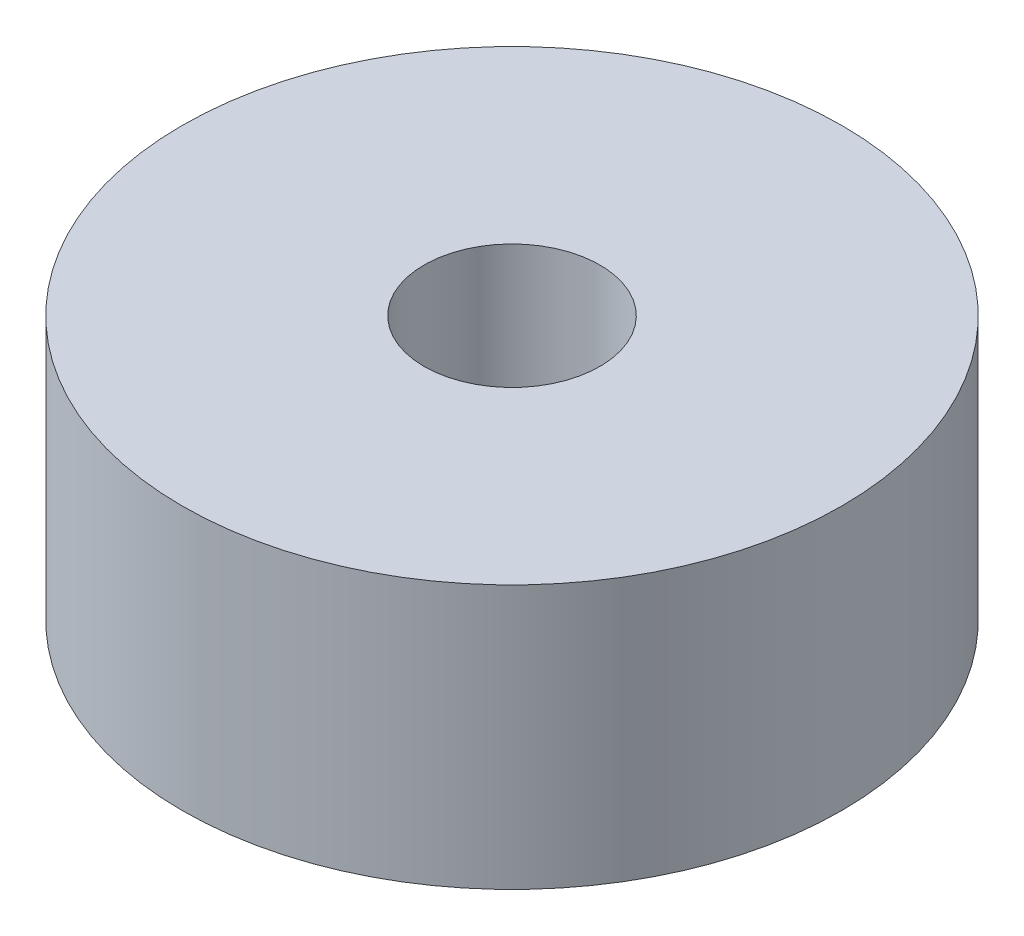
ISO-10303-21;
HEADER;
FILE_DESCRIPTION(('STEP AP214'),'2;1');
FILE_NAME('part.step','',(''),(''),'','','');
FILE_SCHEMA(('AUTOMOTIVE_DESIGN { 1 0 10303 214 1 1 1 1 }'));
ENDSEC;
DATA;
#1=APPLICATION_CONTEXT('core data for automotive mechanical design processes');
#2=APPLICATION_PROTOCOL_DEFINITION('international standard','automotive_design',2000,#1);
#3=PRODUCT_CONTEXT('',#1,'mechanical');
#4=PRODUCT('Part','Part','',(#3));
#5=PRODUCT_RELATED_PRODUCT_CATEGORY('part','',(#4));
#6=PRODUCT_DEFINITION_FORMATION('','',#4);
#7=PRODUCT_DEFINITION_CONTEXT('part definition',#1,'design');
#8=PRODUCT_DEFINITION('design','',#6,#7);
#9=PRODUCT_DEFINITION_SHAPE('','',#8);
#10=(LENGTH_UNIT() NAMED_UNIT(*) SI_UNIT(.MILLI.,.METRE.));
#11=(NAMED_UNIT(*) PLANE_ANGLE_UNIT() SI_UNIT($,.RADIAN.));
#12=(NAMED_UNIT(*) SI_UNIT($,.STERADIAN.) SOLID_ANGLE_UNIT());
#13=UNCERTAINTY_MEASURE_WITH_UNIT(LENGTH_MEASURE(1.E-05),#10,'distance_accuracy_value','');
#14=(GEOMETRIC_REPRESENTATION_CONTEXT(3) GLOBAL_UNCERTAINTY_ASSIGNED_CONTEXT((#13)) GLOBAL_UNIT_ASSIGNED_CONTEXT((#10,
#11,#12)) REPRESENTATION_CONTEXT('',''));
#15=CARTESIAN_POINT('',(0.,0.,0.));
#16=DIRECTION('',(0.,0.,1.));
#17=DIRECTION('',(1.,0.,0.));
#18=AXIS2_PLACEMENT_3D('',#15,#16,#17);
#19=CARTESIAN_POINT('',(0.,12.,0.));
#20=DIRECTION('',(0.,1.,0.));
#21=DIRECTION('',(0.,0.,1.));
#22=AXIS2_PLACEMENT_3D('',#19,#20,#21);
#23=PLANE('',#22);
#24=CARTESIAN_POINT('',(0.,12.,0.));
#25=DIRECTION('',(0.,1.,0.));
#26=DIRECTION('',(0.,0.,1.));
#27=AXIS2_PLACEMENT_3D('',#24,#25,#26);
#28=CIRCLE('',#27,15.);
#29=CARTESIAN_POINT('',(0.,12.,15.));
#30=VERTEX_POINT('',#29);
#31=EDGE_CURVE('E10',#30,#30,#28,.T.);
#32=ORIENTED_EDGE('',*,*,#31,.T.);
#33=EDGE_LOOP('',(#32));
#34=FACE_BOUND('',#33,.T.);
#35=CARTESIAN_POINT('',(0.,12.,0.));
#36=DIRECTION('',(0.,1.,0.));
#37=DIRECTION('',(0.,0.,1.));
#38=AXIS2_PLACEMENT_3D('',#35,#36,#37);
#39=CIRCLE('',#38,4.);
#40=CARTESIAN_POINT('',(0.,12.,4.));
#41=VERTEX_POINT('',#40);
#42=EDGE_CURVE('E43',#41,#41,#39,.T.);
#43=ORIENTED_EDGE('',*,*,#42,.F.);
#44=EDGE_LOOP('',(#43));
#45=FACE_BOUND('',#44,.T.);
#46=ADVANCED_FACE('F32',(#34,#45),#23,.T.);
#47=CARTESIAN_POINT('',(0.,0.,0.));
#48=DIRECTION('',(0.,1.,0.));
#49=DIRECTION('',(0.,0.,1.));
#50=AXIS2_PLACEMENT_3D('',#47,#48,#49);
#51=PLANE('',#50);
#52=CARTESIAN_POINT('',(0.,0.,0.));
#53=DIRECTION('',(0.,1.,0.));
#54=DIRECTION('',(0.,0.,1.));
#55=AXIS2_PLACEMENT_3D('',#52,#53,#54);
#56=CIRCLE('',#55,15.);
#57=CARTESIAN_POINT('',(0.,0.,15.));
#58=VERTEX_POINT('',#57);
#59=EDGE_CURVE('E36',#58,#58,#56,.T.);
#60=ORIENTED_EDGE('',*,*,#59,.F.);
#61=EDGE_LOOP('',(#60));
#62=FACE_BOUND('',#61,.T.);
#63=CARTESIAN_POINT('',(0.,0.,0.));
#64=DIRECTION('',(0.,1.,0.));
#65=DIRECTION('',(0.,0.,1.));
#66=AXIS2_PLACEMENT_3D('',#63,#64,#65);
#67=CIRCLE('',#66,4.);
#68=CARTESIAN_POINT('',(0.,0.,4.));
#69=VERTEX_POINT('',#68);
#70=EDGE_CURVE('E45',#69,#69,#67,.T.);
#71=ORIENTED_EDGE('',*,*,#70,.T.);
#72=EDGE_LOOP('',(#71));
#73=FACE_BOUND('',#72,.T.);
#74=ADVANCED_FACE('F55',(#62,#73),#51,.F.);
#75=CARTESIAN_POINT('',(0.,12.,0.));
#76=DIRECTION('',(0.,-1.,0.));
#77=DIRECTION('',(0.,0.,-1.));
#78=AXIS2_PLACEMENT_3D('',#75,#76,#77);
#79=CYLINDRICAL_SURFACE('',#78,15.);
#80=ORIENTED_EDGE('',*,*,#31,.F.);
#81=EDGE_LOOP('',(#80));
#82=FACE_BOUND('',#81,.T.);
#83=ORIENTED_EDGE('',*,*,#59,.T.);
#84=EDGE_LOOP('',(#83));
#85=FACE_BOUND('',#84,.T.);
#86=ADVANCED_FACE('F34',(#82,#85),#79,.T.);
#87=CARTESIAN_POINT('',(0.,12.,0.));
#88=DIRECTION('',(0.,-1.,0.));
#89=DIRECTION('',(0.,0.,-1.));
#90=AXIS2_PLACEMENT_3D('',#87,#88,#89);
#91=CYLINDRICAL_SURFACE('',#90,4.);
#92=ORIENTED_EDGE('',*,*,#42,.T.);
#93=EDGE_LOOP('',(#92));
#94=FACE_BOUND('',#93,.T.);
#95=ORIENTED_EDGE('',*,*,#70,.F.);
#96=EDGE_LOOP('',(#95));
#97=FACE_BOUND('',#96,.T.);
#98=ADVANCED_FACE('F51',(#94,#97),#91,.F.);
#99=CLOSED_SHELL('',(#46,#74,#86,#98));
#100=MANIFOLD_SOLID_BREP('B2',#99);
#101=ADVANCED_BREP_SHAPE_REPRESENTATION('',(#18,#100),#14);
#102=SHAPE_DEFINITION_REPRESENTATION(#9,#101);
ENDSEC;
END-ISO-10303-21;
